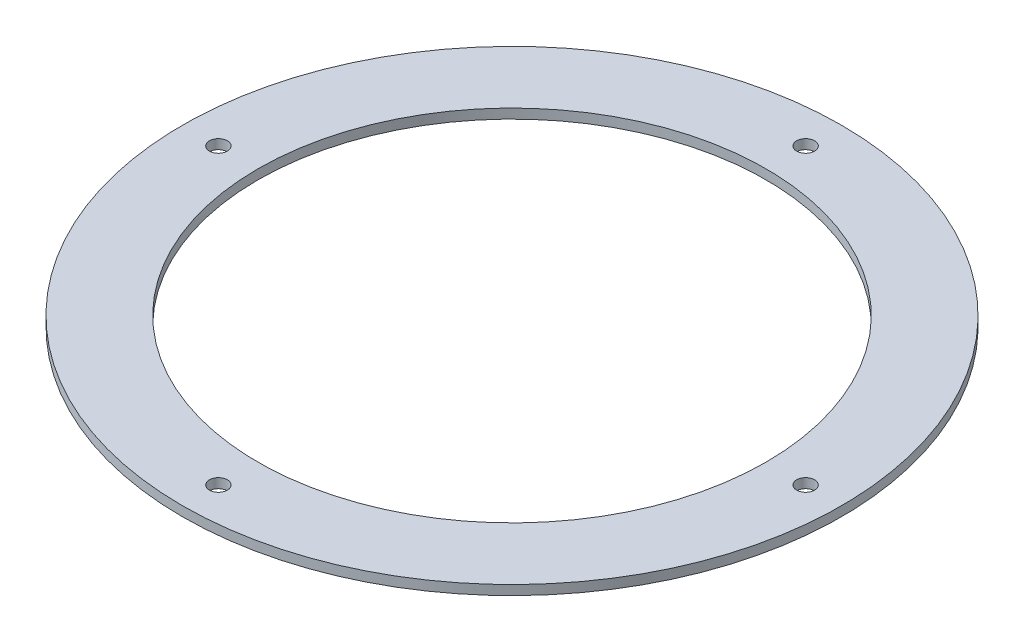
ISO-10303-21;
HEADER;
FILE_DESCRIPTION(('STEP AP214'),'2;1');
FILE_NAME('part.step','',(''),(''),'','','');
FILE_SCHEMA(('AUTOMOTIVE_DESIGN { 1 0 10303 214 1 1 1 1 }'));
ENDSEC;
DATA;
#1=APPLICATION_CONTEXT('core data for automotive mechanical design processes');
#2=APPLICATION_PROTOCOL_DEFINITION('international standard','automotive_design',2000,#1);
#3=PRODUCT_CONTEXT('',#1,'mechanical');
#4=PRODUCT('Part','Part','',(#3));
#5=PRODUCT_RELATED_PRODUCT_CATEGORY('part','',(#4));
#6=PRODUCT_DEFINITION_FORMATION('','',#4);
#7=PRODUCT_DEFINITION_CONTEXT('part definition',#1,'design');
#8=PRODUCT_DEFINITION('design','',#6,#7);
#9=PRODUCT_DEFINITION_SHAPE('','',#8);
#10=(LENGTH_UNIT() NAMED_UNIT(*) SI_UNIT(.MILLI.,.METRE.));
#11=(NAMED_UNIT(*) PLANE_ANGLE_UNIT() SI_UNIT($,.RADIAN.));
#12=(NAMED_UNIT(*) SI_UNIT($,.STERADIAN.) SOLID_ANGLE_UNIT());
#13=UNCERTAINTY_MEASURE_WITH_UNIT(LENGTH_MEASURE(1.E-05),#10,'distance_accuracy_value','');
#14=(GEOMETRIC_REPRESENTATION_CONTEXT(3) GLOBAL_UNCERTAINTY_ASSIGNED_CONTEXT((#13)) GLOBAL_UNIT_ASSIGNED_CONTEXT((#10,
#11,#12)) REPRESENTATION_CONTEXT('',''));
#15=CARTESIAN_POINT('',(0.,0.,0.));
#16=DIRECTION('',(0.,0.,1.));
#17=DIRECTION('',(1.,0.,0.));
#18=AXIS2_PLACEMENT_3D('',#15,#16,#17);
#19=CARTESIAN_POINT('',(0.,1.6,0.));
#20=DIRECTION('',(0.,1.,0.));
#21=DIRECTION('',(0.,0.,1.));
#22=AXIS2_PLACEMENT_3D('',#19,#20,#21);
#23=PLANE('',#22);
#24=CARTESIAN_POINT('',(-49.,1.6,0.));
#25=DIRECTION('',(0.,1.,0.));
#26=DIRECTION('',(0.,0.,1.));
#27=AXIS2_PLACEMENT_3D('',#24,#25,#26);
#28=CIRCLE('',#27,1.5);
#29=CARTESIAN_POINT('',(-49.,1.6,1.5));
#30=VERTEX_POINT('',#29);
#31=EDGE_CURVE('E77',#30,#30,#28,.T.);
#32=ORIENTED_EDGE('',*,*,#31,.F.);
#33=EDGE_LOOP('',(#32));
#34=FACE_BOUND('',#33,.T.);
#35=CARTESIAN_POINT('',(0.,1.6,-49.));
#36=DIRECTION('',(0.,1.,0.));
#37=DIRECTION('',(0.,0.,1.));
#38=AXIS2_PLACEMENT_3D('',#35,#36,#37);
#39=CIRCLE('',#38,1.5);
#40=CARTESIAN_POINT('',(0.,1.6,-47.5));
#41=VERTEX_POINT('',#40);
#42=EDGE_CURVE('E71',#41,#41,#39,.T.);
#43=ORIENTED_EDGE('',*,*,#42,.F.);
#44=EDGE_LOOP('',(#43));
#45=FACE_BOUND('',#44,.T.);
#46=CARTESIAN_POINT('',(49.,1.6,0.));
#47=DIRECTION('',(0.,1.,0.));
#48=DIRECTION('',(0.,0.,-1.));
#49=AXIS2_PLACEMENT_3D('',#46,#47,#48);
#50=CIRCLE('',#49,1.5);
#51=CARTESIAN_POINT('',(49.,1.6,-1.5));
#52=VERTEX_POINT('',#51);
#53=EDGE_CURVE('E64',#52,#52,#50,.T.);
#54=ORIENTED_EDGE('',*,*,#53,.F.);
#55=EDGE_LOOP('',(#54));
#56=FACE_BOUND('',#55,.T.);
#57=CARTESIAN_POINT('',(0.,1.6,49.));
#58=DIRECTION('',(0.,1.,0.));
#59=DIRECTION('',(0.,0.,-1.));
#60=AXIS2_PLACEMENT_3D('',#57,#58,#59);
#61=CIRCLE('',#60,1.5);
#62=CARTESIAN_POINT('',(0.,1.6,47.5));
#63=VERTEX_POINT('',#62);
#64=EDGE_CURVE('E65',#63,#63,#61,.T.);
#65=ORIENTED_EDGE('',*,*,#64,.F.);
#66=EDGE_LOOP('',(#65));
#67=FACE_BOUND('',#66,.T.);
#68=CARTESIAN_POINT('',(0.,1.6,0.));
#69=DIRECTION('',(0.,1.,0.));
#70=DIRECTION('',(0.,0.,1.));
#71=AXIS2_PLACEMENT_3D('',#68,#69,#70);
#72=CIRCLE('',#71,55.);
#73=CARTESIAN_POINT('',(0.,1.6,55.));
#74=VERTEX_POINT('',#73);
#75=EDGE_CURVE('E11',#74,#74,#72,.T.);
#76=ORIENTED_EDGE('',*,*,#75,.T.);
#77=EDGE_LOOP('',(#76));
#78=FACE_BOUND('',#77,.T.);
#79=CARTESIAN_POINT('',(0.,1.6,0.));
#80=DIRECTION('',(0.,1.,0.));
#81=DIRECTION('',(1.,0.,0.));
#82=AXIS2_PLACEMENT_3D('',#79,#80,#81);
#83=CIRCLE('',#82,42.4);
#84=CARTESIAN_POINT('',(42.4,1.6,0.));
#85=VERTEX_POINT('',#84);
#86=EDGE_CURVE('E53',#85,#85,#83,.T.);
#87=ORIENTED_EDGE('',*,*,#86,.F.);
#88=EDGE_LOOP('',(#87));
#89=FACE_BOUND('',#88,.T.);
#90=ADVANCED_FACE('F42',(#34,#45,#56,#67,#78,#89),#23,.T.);
#91=CARTESIAN_POINT('',(0.,0.,0.));
#92=DIRECTION('',(0.,1.,0.));
#93=DIRECTION('',(0.,0.,1.));
#94=AXIS2_PLACEMENT_3D('',#91,#92,#93);
#95=PLANE('',#94);
#96=CARTESIAN_POINT('',(-49.,0.,0.));
#97=DIRECTION('',(0.,1.,0.));
#98=DIRECTION('',(0.,0.,1.));
#99=AXIS2_PLACEMENT_3D('',#96,#97,#98);
#100=CIRCLE('',#99,1.5);
#101=CARTESIAN_POINT('',(-49.,0.,1.5));
#102=VERTEX_POINT('',#101);
#103=EDGE_CURVE('E58',#102,#102,#100,.F.);
#104=ORIENTED_EDGE('',*,*,#103,.F.);
#105=EDGE_LOOP('',(#104));
#106=FACE_BOUND('',#105,.T.);
#107=CARTESIAN_POINT('',(0.,0.,-49.));
#108=DIRECTION('',(0.,1.,0.));
#109=DIRECTION('',(0.,0.,1.));
#110=AXIS2_PLACEMENT_3D('',#107,#108,#109);
#111=CIRCLE('',#110,1.5);
#112=CARTESIAN_POINT('',(0.,0.,-47.5));
#113=VERTEX_POINT('',#112);
#114=EDGE_CURVE('E74',#113,#113,#111,.F.);
#115=ORIENTED_EDGE('',*,*,#114,.F.);
#116=EDGE_LOOP('',(#115));
#117=FACE_BOUND('',#116,.T.);
#118=CARTESIAN_POINT('',(49.,0.,0.));
#119=DIRECTION('',(0.,1.,0.));
#120=DIRECTION('',(0.,0.,1.));
#121=AXIS2_PLACEMENT_3D('',#118,#119,#120);
#122=CIRCLE('',#121,1.5);
#123=CARTESIAN_POINT('',(49.,0.,1.5));
#124=VERTEX_POINT('',#123);
#125=EDGE_CURVE('E68',#124,#124,#122,.F.);
#126=ORIENTED_EDGE('',*,*,#125,.F.);
#127=EDGE_LOOP('',(#126));
#128=FACE_BOUND('',#127,.T.);
#129=CARTESIAN_POINT('',(0.,0.,49.));
#130=DIRECTION('',(0.,1.,0.));
#131=DIRECTION('',(0.,0.,1.));
#132=AXIS2_PLACEMENT_3D('',#129,#130,#131);
#133=CIRCLE('',#132,1.5);
#134=CARTESIAN_POINT('',(0.,0.,50.5));
#135=VERTEX_POINT('',#134);
#136=EDGE_CURVE('E61',#135,#135,#133,.F.);
#137=ORIENTED_EDGE('',*,*,#136,.F.);
#138=EDGE_LOOP('',(#137));
#139=FACE_BOUND('',#138,.T.);
#140=CARTESIAN_POINT('',(0.,0.,0.));
#141=DIRECTION('',(0.,1.,0.));
#142=DIRECTION('',(0.,0.,1.));
#143=AXIS2_PLACEMENT_3D('',#140,#141,#142);
#144=CIRCLE('',#143,55.);
#145=CARTESIAN_POINT('',(0.,0.,55.));
#146=VERTEX_POINT('',#145);
#147=EDGE_CURVE('E46',#146,#146,#144,.T.);
#148=ORIENTED_EDGE('',*,*,#147,.F.);
#149=EDGE_LOOP('',(#148));
#150=FACE_BOUND('',#149,.T.);
#151=CARTESIAN_POINT('',(0.,0.,0.));
#152=DIRECTION('',(0.,1.,0.));
#153=DIRECTION('',(1.,0.,0.));
#154=AXIS2_PLACEMENT_3D('',#151,#152,#153);
#155=CIRCLE('',#154,42.4);
#156=CARTESIAN_POINT('',(42.4,0.,0.));
#157=VERTEX_POINT('',#156);
#158=EDGE_CURVE('E55',#157,#157,#155,.T.);
#159=ORIENTED_EDGE('',*,*,#158,.T.);
#160=EDGE_LOOP('',(#159));
#161=FACE_BOUND('',#160,.T.);
#162=ADVANCED_FACE('F89',(#106,#117,#128,#139,#150,#161),#95,.F.);
#163=CARTESIAN_POINT('',(0.,1.6,0.));
#164=DIRECTION('',(0.,-1.,0.));
#165=DIRECTION('',(0.,0.,-1.));
#166=AXIS2_PLACEMENT_3D('',#163,#164,#165);
#167=CYLINDRICAL_SURFACE('',#166,55.);
#168=ORIENTED_EDGE('',*,*,#75,.F.);
#169=EDGE_LOOP('',(#168));
#170=FACE_BOUND('',#169,.T.);
#171=ORIENTED_EDGE('',*,*,#147,.T.);
#172=EDGE_LOOP('',(#171));
#173=FACE_BOUND('',#172,.T.);
#174=ADVANCED_FACE('F44',(#170,#173),#167,.T.);
#175=CARTESIAN_POINT('',(0.,1.6,0.));
#176=DIRECTION('',(0.,-1.,0.));
#177=DIRECTION('',(0.,0.,-1.));
#178=AXIS2_PLACEMENT_3D('',#175,#176,#177);
#179=CYLINDRICAL_SURFACE('',#178,42.4);
#180=ORIENTED_EDGE('',*,*,#86,.T.);
#181=EDGE_LOOP('',(#180));
#182=FACE_BOUND('',#181,.T.);
#183=ORIENTED_EDGE('',*,*,#158,.F.);
#184=EDGE_LOOP('',(#183));
#185=FACE_BOUND('',#184,.T.);
#186=ADVANCED_FACE('F99',(#182,#185),#179,.F.);
#187=CARTESIAN_POINT('',(0.,-4.24264068711929,49.));
#188=DIRECTION('',(0.,1.,0.));
#189=DIRECTION('',(0.,0.,1.));
#190=AXIS2_PLACEMENT_3D('',#187,#188,#189);
#191=CYLINDRICAL_SURFACE('',#190,1.5);
#192=ORIENTED_EDGE('',*,*,#136,.T.);
#193=EDGE_LOOP('',(#192));
#194=FACE_BOUND('',#193,.T.);
#195=ORIENTED_EDGE('',*,*,#64,.T.);
#196=EDGE_LOOP('',(#195));
#197=FACE_BOUND('',#196,.T.);
#198=ADVANCED_FACE('F102',(#194,#197),#191,.F.);
#199=CARTESIAN_POINT('',(49.,-4.24264068711929,0.));
#200=DIRECTION('',(0.,1.,0.));
#201=DIRECTION('',(0.,0.,1.));
#202=AXIS2_PLACEMENT_3D('',#199,#200,#201);
#203=CYLINDRICAL_SURFACE('',#202,1.5);
#204=ORIENTED_EDGE('',*,*,#125,.T.);
#205=EDGE_LOOP('',(#204));
#206=FACE_BOUND('',#205,.T.);
#207=ORIENTED_EDGE('',*,*,#53,.T.);
#208=EDGE_LOOP('',(#207));
#209=FACE_BOUND('',#208,.T.);
#210=ADVANCED_FACE('F117',(#206,#209),#203,.F.);
#211=CARTESIAN_POINT('',(0.,-4.24264068711929,-49.));
#212=DIRECTION('',(0.,1.,0.));
#213=DIRECTION('',(0.,0.,1.));
#214=AXIS2_PLACEMENT_3D('',#211,#212,#213);
#215=CYLINDRICAL_SURFACE('',#214,1.5);
#216=ORIENTED_EDGE('',*,*,#114,.T.);
#217=EDGE_LOOP('',(#216));
#218=FACE_BOUND('',#217,.T.);
#219=ORIENTED_EDGE('',*,*,#42,.T.);
#220=EDGE_LOOP('',(#219));
#221=FACE_BOUND('',#220,.T.);
#222=ADVANCED_FACE('F121',(#218,#221),#215,.F.);
#223=CARTESIAN_POINT('',(-49.,-4.24264068711929,0.));
#224=DIRECTION('',(0.,1.,0.));
#225=DIRECTION('',(0.,0.,1.));
#226=AXIS2_PLACEMENT_3D('',#223,#224,#225);
#227=CYLINDRICAL_SURFACE('',#226,1.5);
#228=ORIENTED_EDGE('',*,*,#103,.T.);
#229=EDGE_LOOP('',(#228));
#230=FACE_BOUND('',#229,.T.);
#231=ORIENTED_EDGE('',*,*,#31,.T.);
#232=EDGE_LOOP('',(#231));
#233=FACE_BOUND('',#232,.T.);
#234=ADVANCED_FACE('F85',(#230,#233),#227,.F.);
#235=CLOSED_SHELL('',(#90,#162,#174,#186,#198,#210,#222,#234));
#236=MANIFOLD_SOLID_BREP('B2',#235);
#237=ADVANCED_BREP_SHAPE_REPRESENTATION('',(#18,#236),#14);
#238=SHAPE_DEFINITION_REPRESENTATION(#9,#237);
ENDSEC;
END-ISO-10303-21;
